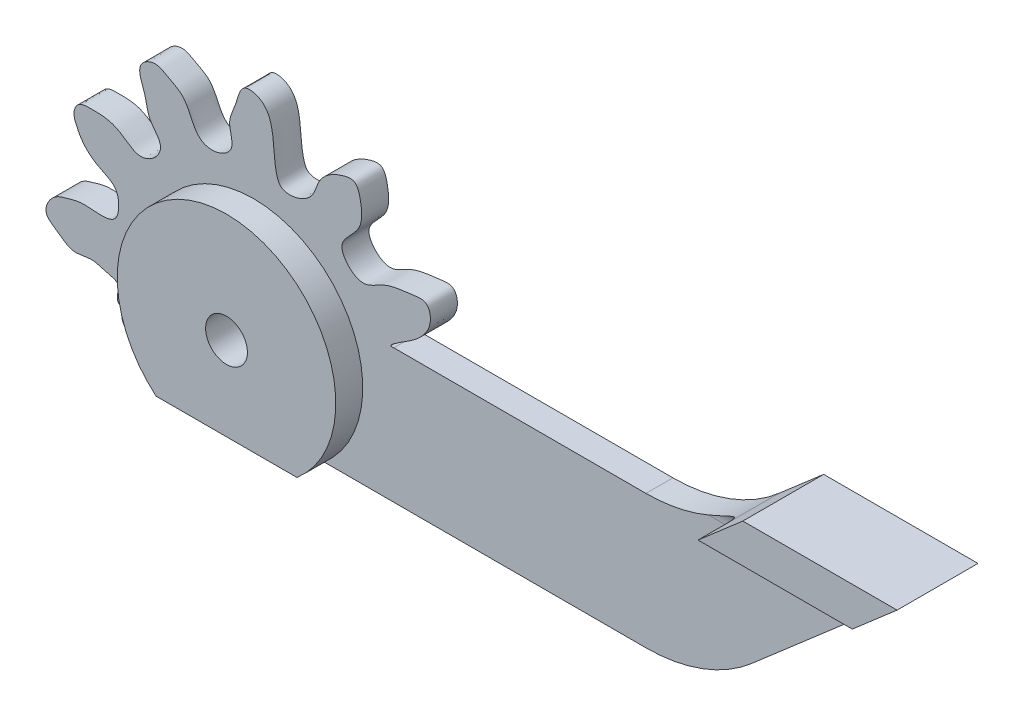
ISO-10303-21;
HEADER;
FILE_DESCRIPTION(('STEP AP214'),'2;1');
FILE_NAME('part.step','',(''),(''),'','','');
FILE_SCHEMA(('AUTOMOTIVE_DESIGN { 1 0 10303 214 1 1 1 1 }'));
ENDSEC;
DATA;
#1=APPLICATION_CONTEXT('core data for automotive mechanical design processes');
#2=APPLICATION_PROTOCOL_DEFINITION('international standard','automotive_design',2000,#1);
#3=PRODUCT_CONTEXT('',#1,'mechanical');
#4=PRODUCT('Part','Part','',(#3));
#5=PRODUCT_RELATED_PRODUCT_CATEGORY('part','',(#4));
#6=PRODUCT_DEFINITION_FORMATION('','',#4);
#7=PRODUCT_DEFINITION_CONTEXT('part definition',#1,'design');
#8=PRODUCT_DEFINITION('design','',#6,#7);
#9=PRODUCT_DEFINITION_SHAPE('','',#8);
#10=(LENGTH_UNIT() NAMED_UNIT(*) SI_UNIT(.MILLI.,.METRE.));
#11=(NAMED_UNIT(*) PLANE_ANGLE_UNIT() SI_UNIT($,.RADIAN.));
#12=(NAMED_UNIT(*) SI_UNIT($,.STERADIAN.) SOLID_ANGLE_UNIT());
#13=UNCERTAINTY_MEASURE_WITH_UNIT(LENGTH_MEASURE(1.E-05),#10,'distance_accuracy_value','');
#14=(GEOMETRIC_REPRESENTATION_CONTEXT(3) GLOBAL_UNCERTAINTY_ASSIGNED_CONTEXT((#13)) GLOBAL_UNIT_ASSIGNED_CONTEXT((#10,
#11,#12)) REPRESENTATION_CONTEXT('',''));
#15=CARTESIAN_POINT('',(0.,0.,0.));
#16=DIRECTION('',(0.,0.,1.));
#17=DIRECTION('',(1.,0.,0.));
#18=AXIS2_PLACEMENT_3D('',#15,#16,#17);
#19=CARTESIAN_POINT('',(39.415666495628,19.4070161025371,10.));
#20=DIRECTION('',(0.,0.,-1.));
#21=DIRECTION('',(-1.,0.,0.));
#22=AXIS2_PLACEMENT_3D('',#19,#20,#21);
#23=CYLINDRICAL_SURFACE('',#22,20.2702286247449);
#24=CARTESIAN_POINT('',(39.415666495628,19.4070161025371,0.));
#25=DIRECTION('',(0.,0.,1.));
#26=DIRECTION('',(1.,0.,0.));
#27=AXIS2_PLACEMENT_3D('',#24,#25,#26);
#28=CIRCLE('',#27,20.2702286247449);
#29=CARTESIAN_POINT('',(52.4767262859784,3.90569726663405,0.));
#30=VERTEX_POINT('',#29);
#31=CARTESIAN_POINT('',(26.3546067052777,3.90569726663405,0.));
#32=VERTEX_POINT('',#31);
#33=EDGE_CURVE('E75',#30,#32,#28,.T.);
#34=ORIENTED_EDGE('',*,*,#33,.T.);
#35=DIRECTION('',(0.,0.,-1.));
#36=VECTOR('',#35,1.);
#37=CARTESIAN_POINT('',(26.3546067052777,3.90569726663405,10.));
#38=LINE('',#37,#36);
#39=CARTESIAN_POINT('',(26.3546067052777,3.90569726663405,10.));
#40=VERTEX_POINT('',#39);
#41=EDGE_CURVE('E12',#40,#32,#38,.T.);
#42=ORIENTED_EDGE('',*,*,#41,.F.);
#43=CARTESIAN_POINT('',(39.415666495628,19.4070161025371,10.));
#44=DIRECTION('',(0.,0.,1.));
#45=DIRECTION('',(1.,0.,0.));
#46=AXIS2_PLACEMENT_3D('',#43,#44,#45);
#47=CIRCLE('',#46,20.2702286247449);
#48=CARTESIAN_POINT('',(52.4767262859784,3.90569726663405,10.));
#49=VERTEX_POINT('',#48);
#50=EDGE_CURVE('E77',#49,#40,#47,.T.);
#51=ORIENTED_EDGE('',*,*,#50,.F.);
#52=DIRECTION('',(0.,0.,-1.));
#53=VECTOR('',#52,1.);
#54=CARTESIAN_POINT('',(52.4767262859784,3.90569726663405,10.));
#55=LINE('',#54,#53);
#56=EDGE_CURVE('E59',#49,#30,#55,.T.);
#57=ORIENTED_EDGE('',*,*,#56,.T.);
#58=EDGE_LOOP('',(#34,#42,#51,#57));
#59=FACE_BOUND('',#58,.T.);
#60=ADVANCED_FACE('F51',(#59),#23,.T.);
#61=CARTESIAN_POINT('',(52.4767262859784,3.90569726663405,10.));
#62=DIRECTION('',(0.,-1.,0.));
#63=DIRECTION('',(0.,0.,-1.));
#64=AXIS2_PLACEMENT_3D('',#61,#62,#63);
#65=PLANE('',#64);
#66=DIRECTION('',(-1.,0.,0.));
#67=VECTOR('',#66,1.);
#68=CARTESIAN_POINT('',(52.4767262859784,3.90569726663405,0.));
#69=LINE('',#68,#67);
#70=EDGE_CURVE('E82',#30,#32,#69,.T.);
#71=ORIENTED_EDGE('',*,*,#70,.F.);
#72=ORIENTED_EDGE('',*,*,#56,.F.);
#73=DIRECTION('',(-1.,0.,0.));
#74=VECTOR('',#73,1.);
#75=CARTESIAN_POINT('',(52.4767262859784,3.90569726663405,10.));
#76=LINE('',#75,#74);
#77=EDGE_CURVE('E79',#49,#40,#76,.T.);
#78=ORIENTED_EDGE('',*,*,#77,.T.);
#79=ORIENTED_EDGE('',*,*,#41,.T.);
#80=EDGE_LOOP('',(#71,#72,#78,#79));
#81=FACE_BOUND('',#80,.T.);
#82=ADVANCED_FACE('F85',(#81),#65,.T.);
#83=CARTESIAN_POINT('',(39.415666495628,19.4070161025371,10.));
#84=DIRECTION('',(0.,0.,1.));
#85=DIRECTION('',(1.,0.,0.));
#86=AXIS2_PLACEMENT_3D('',#83,#84,#85);
#87=PLANE('',#86);
#88=CARTESIAN_POINT('',(39.415666495628,19.4070161025371,10.));
#89=DIRECTION('',(0.,0.,1.));
#90=DIRECTION('',(1.,0.,0.));
#91=AXIS2_PLACEMENT_3D('',#88,#89,#90);
#92=CIRCLE('',#91,3.87742038559669);
#93=CARTESIAN_POINT('',(43.2930868812247,19.4070161025371,10.));
#94=VERTEX_POINT('',#93);
#95=EDGE_CURVE('E90',#94,#94,#92,.T.);
#96=ORIENTED_EDGE('',*,*,#95,.F.);
#97=EDGE_LOOP('',(#96));
#98=FACE_BOUND('',#97,.T.);
#99=ORIENTED_EDGE('',*,*,#50,.T.);
#100=ORIENTED_EDGE('',*,*,#77,.F.);
#101=EDGE_LOOP('',(#99,#100));
#102=FACE_BOUND('',#101,.T.);
#103=ADVANCED_FACE('F103',(#98,#102),#87,.T.);
#104=CARTESIAN_POINT('',(39.415666495628,19.4070161025371,0.));
#105=DIRECTION('',(0.,0.,1.));
#106=DIRECTION('',(1.,0.,0.));
#107=AXIS2_PLACEMENT_3D('',#104,#105,#106);
#108=PLANE('',#107);
#109=CARTESIAN_POINT('',(39.415666495628,19.4070161025371,0.));
#110=DIRECTION('',(0.,0.,1.));
#111=DIRECTION('',(1.,0.,0.));
#112=AXIS2_PLACEMENT_3D('',#109,#110,#111);
#113=CIRCLE('',#112,3.87742038559669);
#114=CARTESIAN_POINT('',(43.2930868812247,19.4070161025371,0.));
#115=VERTEX_POINT('',#114);
#116=EDGE_CURVE('E83',#115,#115,#113,.T.);
#117=ORIENTED_EDGE('',*,*,#116,.T.);
#118=EDGE_LOOP('',(#117));
#119=FACE_BOUND('',#118,.T.);
#120=ORIENTED_EDGE('',*,*,#33,.F.);
#121=ORIENTED_EDGE('',*,*,#70,.T.);
#122=EDGE_LOOP('',(#120,#121));
#123=FACE_BOUND('',#122,.T.);
#124=ADVANCED_FACE('F81',(#119,#123),#108,.F.);
#125=CARTESIAN_POINT('',(39.415666495628,19.4070161025371,0.));
#126=DIRECTION('',(0.,0.,1.));
#127=DIRECTION('',(1.,0.,0.));
#128=AXIS2_PLACEMENT_3D('',#125,#126,#127);
#129=CYLINDRICAL_SURFACE('',#128,3.87742038559669);
#130=ORIENTED_EDGE('',*,*,#116,.F.);
#131=EDGE_LOOP('',(#130));
#132=FACE_BOUND('',#131,.T.);
#133=ORIENTED_EDGE('',*,*,#95,.T.);
#134=EDGE_LOOP('',(#133));
#135=FACE_BOUND('',#134,.T.);
#136=ADVANCED_FACE('F97',(#132,#135),#129,.F.);
#137=CLOSED_SHELL('',(#60,#82,#103,#124,#136));
#138=MANIFOLD_SOLID_BREP('B2',#137);
#139=CARTESIAN_POINT('',(15.2096444111176,9.97968430753762,5.));
#140=CARTESIAN_POINT('',(13.2812394112684,10.363568562619,5.));
#141=CARTESIAN_POINT('',(15.5409479278548,13.6056661087961,5.));
#142=CARTESIAN_POINT('',(11.8960696273522,14.1744904956881,5.));
#143=CARTESIAN_POINT('',(9.41472392617126,15.2837824863121,5.));
#144=CARTESIAN_POINT('',(5.84577228653019,13.9195039232922,5.));
#145=CARTESIAN_POINT('',(3.32447443002871,16.1594676521129,5.));
#146=CARTESIAN_POINT('',(0.108136148444864,17.949329474019,5.));
#147=CARTESIAN_POINT('',(2.00428086387749,21.6553190020502,5.));
#148=CARTESIAN_POINT('',(4.83312567613509,22.4395628591093,5.));
#149=CARTESIAN_POINT('',(7.75078146066194,23.2339828730488,5.));
#150=CARTESIAN_POINT('',(10.55114440638,22.735013364721,5.));
#151=CARTESIAN_POINT('',(14.0598197716537,23.0101572900811,5.));
#152=CARTESIAN_POINT('',(14.6059543172087,26.0947553540203,5.));
#153=CARTESIAN_POINT('',(13.9721102271966,29.086650125727,5.));
#154=CARTESIAN_POINT('',(10.5072725974297,30.3014618215186,5.));
#155=CARTESIAN_POINT('',(7.9513678270161,32.3460104271725,5.));
#156=CARTESIAN_POINT('',(6.62718359713608,34.8128911148974,5.));
#157=CARTESIAN_POINT('',(5.83683228221396,36.7719163365309,5.));
#158=CARTESIAN_POINT('',(6.90615802743257,39.0385229301238,5.));
#159=CARTESIAN_POINT('',(9.89872652748119,39.0453688187228,5.));
#160=CARTESIAN_POINT('',(12.7362153710987,38.9952326924493,5.));
#161=CARTESIAN_POINT('',(15.5408859462902,37.5004095880644,5.));
#162=CARTESIAN_POINT('',(18.1574843118457,35.2644587234455,5.));
#163=CARTESIAN_POINT('',(21.3930666976063,36.8883233474547,5.));
#164=CARTESIAN_POINT('',(22.7711430009313,40.0899680700124,5.));
#165=CARTESIAN_POINT('',(19.8262806533943,42.4313643406528,5.));
#166=CARTESIAN_POINT('',(19.6056833608479,46.3863892380823,5.));
#167=CARTESIAN_POINT('',(17.0681696084714,50.6713055678059,5.));
#168=CARTESIAN_POINT('',(21.211474567562,52.6785628083915,5.));
#169=CARTESIAN_POINT('',(23.719932093889,51.1311240842665,5.));
#170=CARTESIAN_POINT('',(26.4606619234267,49.9140476634965,5.));
#171=CARTESIAN_POINT('',(27.8481008740992,46.8411658178877,5.));
#172=CARTESIAN_POINT('',(29.3765187861785,43.7801231747238,5.));
#173=CARTESIAN_POINT('',(32.930275422778,43.3517409507978,5.));
#174=CARTESIAN_POINT('',(36.2842604956314,45.6861185984047,5.));
#175=CARTESIAN_POINT('',(34.3194898999652,49.7106001444772,5.));
#176=CARTESIAN_POINT('',(36.3256799593775,52.9415088850657,5.));
#177=CARTESIAN_POINT('',(37.0189571453503,57.4860230593159,5.));
#178=CARTESIAN_POINT('',(41.5584164467512,56.3191860063089,5.));
#179=CARTESIAN_POINT('',(43.405482683016,51.8019787660292,5.));
#180=CARTESIAN_POINT('',(43.0466348301985,47.7708596963115,5.));
#181=CARTESIAN_POINT('',(44.3829726718081,43.4741934454998,5.));
#182=CARTESIAN_POINT('',(47.9539881976018,43.5818910244991,5.));
#183=CARTESIAN_POINT('',(50.653934449939,45.4846918597356,5.));
#184=CARTESIAN_POINT('',(51.5597023071631,49.4586580840743,5.));
#185=CARTESIAN_POINT('',(54.5931918783009,51.4093636145941,5.));
#186=CARTESIAN_POINT('',(58.5849168323416,52.2743012092694,5.));
#187=CARTESIAN_POINT('',(59.5661344349158,48.3250216380914,5.));
#188=CARTESIAN_POINT('',(59.682159996152,44.047072630065,5.));
#189=CARTESIAN_POINT('',(54.9863467534639,41.209123758002,5.));
#190=CARTESIAN_POINT('',(56.7526925196278,37.5706693816871,5.));
#191=CARTESIAN_POINT('',(59.8265787402288,35.4456014072274,5.));
#192=CARTESIAN_POINT('',(63.8708438457671,38.4956234264064,5.));
#193=CARTESIAN_POINT('',(67.5710932302871,38.7288140631102,5.));
#194=CARTESIAN_POINT('',(71.7470448028108,39.4081574248454,5.));
#195=CARTESIAN_POINT('',(72.8305822029521,35.3228178835334,5.));
#196=CARTESIAN_POINT('',(69.6894235093443,32.0103288326518,5.));
#197=CARTESIAN_POINT('',(67.3772303033655,30.7156132713001,5.));
#198=CARTESIAN_POINT('',(64.1194138088529,28.5241532581021,5.));
#199=CARTESIAN_POINT('',(65.4493024148734,28.7160131888127,5.));
#200=B_SPLINE_CURVE_WITH_KNOTS('',3,(#139,#140,#141,#142,#143,#144,#145,#146,#147,#148,#149,
#150,#151,#152,#153,#154,#155,#156,#157,#158,#159,#160,#161,#162,#163,#164,#165,#166,#167,#168,
#169,#170,#171,#172,#173,#174,#175,#176,#177,#178,#179,#180,#181,#182,#183,#184,#185,#186,#187,
#188,#189,#190,#191,#192,#193,#194,#195,#196,#197,#198,#199),.UNSPECIFIED.,.F.,.F.,(4,1,1,1,1,1,
1,1,1,1,1,1,1,1,1,1,1,1,1,1,1,1,1,1,1,1,1,1,1,1,1,1,1,1,1,1,1,1,1,1,1,1,1,1,1,1,1,1,1,1,1,1,1,1,
1,1,1,1,4),(0.,0.0180826304582996,0.0294270811508162,0.0442216103312733,0.063460114385005,
0.0800363581027234,0.0950671107742006,0.112886037354315,0.127916790025792,0.141223750458327,
0.159055851847325,0.173850381027782,0.188160769885949,0.200964039878945,0.218835607420363,
0.240246417504569,0.251297246649715,0.262600218407398,0.271795064050294,0.285102024482828,
0.304401467884786,0.316661262075313,0.334440605652273,0.353445758219558,0.362991486223038,
0.384159610558991,0.399787843011524,0.42683069534502,0.442771374586194,0.453843434930827,
0.471715002472244,0.487699818427079,0.505386457159968,0.521282877141525,0.537873282539501,
0.557753673848156,0.57752579922451,0.59775445963888,0.614528438902255,0.632584081752777,
0.669920137159158,0.679857379116126,0.696387655654468,0.714648165372121,0.729010973412608,
0.756644506005,0.768187608437239,0.783639326994869,0.807616550927122,0.835445203560578,
0.846136559508647,0.865318338654449,0.884866848636363,0.91519590447389,0.928380171735728,
0.940606205006962,0.968676850479003,0.986468342205925,1.),.UNSPECIFIED.);
#201=DIRECTION('',(0.,0.,-1.));
#202=VECTOR('',#201,1.);
#203=SURFACE_OF_LINEAR_EXTRUSION('',#200,#202);
#204=CARTESIAN_POINT('',(15.2096444111176,9.97968430753762,0.));
#205=CARTESIAN_POINT('',(13.2812394112684,10.363568562619,0.));
#206=CARTESIAN_POINT('',(15.5409479278548,13.6056661087961,0.));
#207=CARTESIAN_POINT('',(11.8960696273522,14.1744904956881,0.));
#208=CARTESIAN_POINT('',(9.41472392617126,15.2837824863121,0.));
#209=CARTESIAN_POINT('',(5.84577228653019,13.9195039232922,0.));
#210=CARTESIAN_POINT('',(3.32447443002871,16.1594676521129,0.));
#211=CARTESIAN_POINT('',(0.108136148444864,17.949329474019,0.));
#212=CARTESIAN_POINT('',(2.00428086387749,21.6553190020502,0.));
#213=CARTESIAN_POINT('',(4.83312567613509,22.4395628591093,0.));
#214=CARTESIAN_POINT('',(7.75078146066194,23.2339828730488,0.));
#215=CARTESIAN_POINT('',(10.55114440638,22.735013364721,0.));
#216=CARTESIAN_POINT('',(14.0598197716537,23.0101572900811,0.));
#217=CARTESIAN_POINT('',(14.6059543172087,26.0947553540203,0.));
#218=CARTESIAN_POINT('',(13.9721102271966,29.086650125727,0.));
#219=CARTESIAN_POINT('',(10.5072725974297,30.3014618215186,0.));
#220=CARTESIAN_POINT('',(7.9513678270161,32.3460104271725,0.));
#221=CARTESIAN_POINT('',(6.62718359713608,34.8128911148974,0.));
#222=CARTESIAN_POINT('',(5.83683228221396,36.7719163365309,0.));
#223=CARTESIAN_POINT('',(6.90615802743257,39.0385229301238,0.));
#224=CARTESIAN_POINT('',(9.89872652748119,39.0453688187228,0.));
#225=CARTESIAN_POINT('',(12.7362153710987,38.9952326924493,0.));
#226=CARTESIAN_POINT('',(15.5408859462902,37.5004095880644,0.));
#227=CARTESIAN_POINT('',(18.1574843118457,35.2644587234455,0.));
#228=CARTESIAN_POINT('',(21.3930666976063,36.8883233474547,0.));
#229=CARTESIAN_POINT('',(22.7711430009313,40.0899680700124,0.));
#230=CARTESIAN_POINT('',(19.8262806533943,42.4313643406528,0.));
#231=CARTESIAN_POINT('',(19.6056833608479,46.3863892380823,0.));
#232=CARTESIAN_POINT('',(17.0681696084714,50.6713055678059,0.));
#233=CARTESIAN_POINT('',(21.211474567562,52.6785628083915,0.));
#234=CARTESIAN_POINT('',(23.719932093889,51.1311240842665,0.));
#235=CARTESIAN_POINT('',(26.4606619234267,49.9140476634965,0.));
#236=CARTESIAN_POINT('',(27.8481008740992,46.8411658178877,0.));
#237=CARTESIAN_POINT('',(29.3765187861785,43.7801231747238,0.));
#238=CARTESIAN_POINT('',(32.930275422778,43.3517409507978,0.));
#239=CARTESIAN_POINT('',(36.2842604956314,45.6861185984047,0.));
#240=CARTESIAN_POINT('',(34.3194898999652,49.7106001444772,0.));
#241=CARTESIAN_POINT('',(36.3256799593775,52.9415088850657,0.));
#242=CARTESIAN_POINT('',(37.0189571453503,57.4860230593159,0.));
#243=CARTESIAN_POINT('',(41.5584164467512,56.3191860063089,0.));
#244=CARTESIAN_POINT('',(43.405482683016,51.8019787660292,0.));
#245=CARTESIAN_POINT('',(43.0466348301985,47.7708596963115,0.));
#246=CARTESIAN_POINT('',(44.3829726718081,43.4741934454998,0.));
#247=CARTESIAN_POINT('',(47.9539881976018,43.5818910244991,0.));
#248=CARTESIAN_POINT('',(50.653934449939,45.4846918597356,0.));
#249=CARTESIAN_POINT('',(51.5597023071631,49.4586580840743,0.));
#250=CARTESIAN_POINT('',(54.5931918783009,51.4093636145941,0.));
#251=CARTESIAN_POINT('',(58.5849168323416,52.2743012092694,0.));
#252=CARTESIAN_POINT('',(59.5661344349158,48.3250216380914,0.));
#253=CARTESIAN_POINT('',(59.682159996152,44.047072630065,0.));
#254=CARTESIAN_POINT('',(54.9863467534639,41.209123758002,0.));
#255=CARTESIAN_POINT('',(56.7526925196278,37.5706693816871,0.));
#256=CARTESIAN_POINT('',(59.8265787402288,35.4456014072274,0.));
#257=CARTESIAN_POINT('',(63.8708438457671,38.4956234264064,0.));
#258=CARTESIAN_POINT('',(67.5710932302871,38.7288140631102,0.));
#259=CARTESIAN_POINT('',(71.7470448028108,39.4081574248454,0.));
#260=CARTESIAN_POINT('',(72.8305822029521,35.3228178835334,0.));
#261=CARTESIAN_POINT('',(69.6894235093443,32.0103288326518,0.));
#262=CARTESIAN_POINT('',(67.3772303033655,30.7156132713001,0.));
#263=CARTESIAN_POINT('',(64.1194138088529,28.5241532581021,0.));
#264=CARTESIAN_POINT('',(65.4493024148734,28.7160131888127,0.));
#265=B_SPLINE_CURVE_WITH_KNOTS('',3,(#204,#205,#206,#207,#208,#209,#210,#211,#212,#213,#214,
#215,#216,#217,#218,#219,#220,#221,#222,#223,#224,#225,#226,#227,#228,#229,#230,#231,#232,#233,
#234,#235,#236,#237,#238,#239,#240,#241,#242,#243,#244,#245,#246,#247,#248,#249,#250,#251,#252,
#253,#254,#255,#256,#257,#258,#259,#260,#261,#262,#263,#264),.UNSPECIFIED.,.F.,.F.,(4,1,1,1,1,1,
1,1,1,1,1,1,1,1,1,1,1,1,1,1,1,1,1,1,1,1,1,1,1,1,1,1,1,1,1,1,1,1,1,1,1,1,1,1,1,1,1,1,1,1,1,1,1,1,
1,1,1,1,4),(0.,0.0180826304582996,0.0294270811508162,0.0442216103312733,0.063460114385005,
0.0800363581027234,0.0950671107742006,0.112886037354315,0.127916790025792,0.141223750458327,
0.159055851847325,0.173850381027782,0.188160769885949,0.200964039878945,0.218835607420363,
0.240246417504569,0.251297246649715,0.262600218407398,0.271795064050294,0.285102024482828,
0.304401467884786,0.316661262075313,0.334440605652273,0.353445758219558,0.362991486223038,
0.384159610558991,0.399787843011524,0.42683069534502,0.442771374586194,0.453843434930827,
0.471715002472244,0.487699818427079,0.505386457159968,0.521282877141525,0.537873282539501,
0.557753673848156,0.57752579922451,0.59775445963888,0.614528438902255,0.632584081752777,
0.669920137159158,0.679857379116126,0.696387655654468,0.714648165372121,0.729010973412608,
0.756644506005,0.768187608437239,0.783639326994869,0.807616550927122,0.835445203560578,
0.846136559508647,0.865318338654449,0.884866848636363,0.91519590447389,0.928380171735728,
0.940606205006962,0.968676850479003,0.986468342205925,1.),.UNSPECIFIED.);
#266=CARTESIAN_POINT('',(15.2096444111176,9.97968430753762,0.));
#267=VERTEX_POINT('',#266);
#268=CARTESIAN_POINT('',(65.4493024148734,28.7160131888127,0.));
#269=VERTEX_POINT('',#268);
#270=EDGE_CURVE('E284',#267,#269,#265,.T.);
#271=ORIENTED_EDGE('',*,*,#270,.F.);
#272=DIRECTION('',(0.,0.,-1.));
#273=VECTOR('',#272,1.);
#274=CARTESIAN_POINT('',(15.2096444111176,9.97968430753762,5.));
#275=LINE('',#274,#273);
#276=CARTESIAN_POINT('',(15.2096444111176,9.97968430753762,5.));
#277=VERTEX_POINT('',#276);
#278=EDGE_CURVE('E449',#277,#267,#275,.T.);
#279=ORIENTED_EDGE('',*,*,#278,.F.);
#280=CARTESIAN_POINT('',(65.4493024148734,28.7160131888127,5.));
#281=VERTEX_POINT('',#280);
#282=EDGE_CURVE('E285',#277,#281,#200,.T.);
#283=ORIENTED_EDGE('',*,*,#282,.T.);
#284=DIRECTION('',(0.,0.,-1.));
#285=VECTOR('',#284,1.);
#286=CARTESIAN_POINT('',(65.4493024148734,28.7160131888127,5.));
#287=LINE('',#286,#285);
#288=EDGE_CURVE('E374',#281,#269,#287,.T.);
#289=ORIENTED_EDGE('',*,*,#288,.T.);
#290=EDGE_LOOP('',(#271,#279,#283,#289));
#291=FACE_BOUND('',#290,.T.);
#292=ADVANCED_FACE('F144',(#291),#203,.T.);
#293=CARTESIAN_POINT('',(15.2096444111176,9.97968430753762,5.));
#294=CARTESIAN_POINT('',(13.8781080278113,5.49026163766893,5.));
#295=CARTESIAN_POINT('',(19.4225429995178,6.03859698340414,5.));
#296=CARTESIAN_POINT('',(21.5208288763892,3.90569726663405,5.));
#297=B_SPLINE_CURVE_WITH_KNOTS('',3,(#293,#294,#295,#296),.UNSPECIFIED.,.F.,.F.,(4,4),(0.,1.),.UNSPECIFIED.);
#298=DIRECTION('',(0.,0.,-1.));
#299=VECTOR('',#298,1.);
#300=SURFACE_OF_LINEAR_EXTRUSION('',#297,#299);
#301=CARTESIAN_POINT('',(15.2096444111176,9.97968430753762,0.));
#302=CARTESIAN_POINT('',(13.8781080278113,5.49026163766893,0.));
#303=CARTESIAN_POINT('',(19.4225429995178,6.03859698340414,0.));
#304=CARTESIAN_POINT('',(21.5208288763892,3.90569726663405,0.));
#305=B_SPLINE_CURVE_WITH_KNOTS('',3,(#301,#302,#303,#304),.UNSPECIFIED.,.F.,.F.,(4,4),(0.,1.),.UNSPECIFIED.);
#306=CARTESIAN_POINT('',(21.5208288763892,3.90569726663405,0.));
#307=VERTEX_POINT('',#306);
#308=EDGE_CURVE('E385',#267,#307,#305,.T.);
#309=ORIENTED_EDGE('',*,*,#308,.T.);
#310=DIRECTION('',(0.,0.,-1.));
#311=VECTOR('',#310,1.);
#312=CARTESIAN_POINT('',(21.5208288763892,3.90569726663405,5.));
#313=LINE('',#312,#311);
#314=CARTESIAN_POINT('',(21.5208288763892,3.90569726663405,5.));
#315=VERTEX_POINT('',#314);
#316=EDGE_CURVE('E446',#315,#307,#313,.T.);
#317=ORIENTED_EDGE('',*,*,#316,.F.);
#318=EDGE_CURVE('E292',#277,#315,#297,.T.);
#319=ORIENTED_EDGE('',*,*,#318,.F.);
#320=ORIENTED_EDGE('',*,*,#278,.T.);
#321=EDGE_LOOP('',(#309,#317,#319,#320));
#322=FACE_BOUND('',#321,.T.);
#323=ADVANCED_FACE('F303',(#322),#300,.F.);
#324=CARTESIAN_POINT('',(0.,3.90569726663405,5.));
#325=DIRECTION('',(0.,-1.,0.));
#326=DIRECTION('',(0.,0.,-1.));
#327=AXIS2_PLACEMENT_3D('',#324,#325,#326);
#328=PLANE('',#327);
#329=DIRECTION('',(-1.,0.,0.));
#330=VECTOR('',#329,1.);
#331=CARTESIAN_POINT('',(0.,3.90569726663405,0.));
#332=LINE('',#331,#330);
#333=CARTESIAN_POINT('',(26.3546067052777,3.90569726663405,0.));
#334=VERTEX_POINT('',#333);
#335=EDGE_CURVE('E394',#334,#307,#332,.T.);
#336=ORIENTED_EDGE('',*,*,#335,.F.);
#337=DIRECTION('',(0.,0.,-1.));
#338=VECTOR('',#337,1.);
#339=CARTESIAN_POINT('',(26.3546067052777,3.90569726663405,5.));
#340=LINE('',#339,#338);
#341=CARTESIAN_POINT('',(26.3546067052777,3.90569726663405,5.));
#342=VERTEX_POINT('',#341);
#343=EDGE_CURVE('E443',#342,#334,#340,.T.);
#344=ORIENTED_EDGE('',*,*,#343,.F.);
#345=DIRECTION('',(-1.,0.,0.));
#346=VECTOR('',#345,1.);
#347=CARTESIAN_POINT('',(0.,3.90569726663405,5.));
#348=LINE('',#347,#346);
#349=EDGE_CURVE('E474',#342,#315,#348,.T.);
#350=ORIENTED_EDGE('',*,*,#349,.T.);
#351=ORIENTED_EDGE('',*,*,#316,.T.);
#352=EDGE_LOOP('',(#336,#344,#350,#351));
#353=FACE_BOUND('',#352,.T.);
#354=ADVANCED_FACE('F307',(#353),#328,.T.);
#355=CARTESIAN_POINT('',(39.415666495628,19.4070161025371,5.));
#356=DIRECTION('',(0.,0.,-1.));
#357=DIRECTION('',(-1.,0.,0.));
#358=AXIS2_PLACEMENT_3D('',#355,#356,#357);
#359=CYLINDRICAL_SURFACE('',#358,20.2702286247449);
#360=CARTESIAN_POINT('',(39.415666495628,19.4070161025371,0.));
#361=DIRECTION('',(0.,0.,1.));
#362=DIRECTION('',(1.,0.,0.));
#363=AXIS2_PLACEMENT_3D('',#360,#361,#362);
#364=CIRCLE('',#363,20.2702286247449);
#365=CARTESIAN_POINT('',(52.4767262859784,3.90569726663405,0.));
#366=VERTEX_POINT('',#365);
#367=EDGE_CURVE('E401',#366,#334,#364,.T.);
#368=ORIENTED_EDGE('',*,*,#367,.F.);
#369=DIRECTION('',(0.,0.,-1.));
#370=VECTOR('',#369,1.);
#371=CARTESIAN_POINT('',(52.4767262859784,3.90569726663405,5.));
#372=LINE('',#371,#370);
#373=CARTESIAN_POINT('',(52.4767262859784,3.90569726663405,5.));
#374=VERTEX_POINT('',#373);
#375=EDGE_CURVE('E440',#374,#366,#372,.T.);
#376=ORIENTED_EDGE('',*,*,#375,.F.);
#377=CARTESIAN_POINT('',(39.415666495628,19.4070161025371,5.));
#378=DIRECTION('',(0.,0.,1.));
#379=DIRECTION('',(1.,0.,0.));
#380=AXIS2_PLACEMENT_3D('',#377,#378,#379);
#381=CIRCLE('',#380,20.2702286247449);
#382=EDGE_CURVE('E476',#374,#342,#381,.T.);
#383=ORIENTED_EDGE('',*,*,#382,.T.);
#384=ORIENTED_EDGE('',*,*,#343,.T.);
#385=EDGE_LOOP('',(#368,#376,#383,#384));
#386=FACE_BOUND('',#385,.T.);
#387=ADVANCED_FACE('F309',(#386),#359,.F.);
#388=CARTESIAN_POINT('',(112.213678781945,3.90569726663405,0.));
#389=VERTEX_POINT('',#388);
#390=EDGE_CURVE('E402',#389,#366,#332,.T.);
#391=ORIENTED_EDGE('',*,*,#390,.F.);
#392=DIRECTION('',(0.,0.,-1.));
#393=VECTOR('',#392,1.);
#394=CARTESIAN_POINT('',(112.213678781945,3.90569726663405,5.));
#395=LINE('',#394,#393);
#396=CARTESIAN_POINT('',(112.213678781945,3.90569726663405,5.));
#397=VERTEX_POINT('',#396);
#398=EDGE_CURVE('E437',#397,#389,#395,.T.);
#399=ORIENTED_EDGE('',*,*,#398,.F.);
#400=EDGE_CURVE('E477',#397,#374,#348,.T.);
#401=ORIENTED_EDGE('',*,*,#400,.T.);
#402=ORIENTED_EDGE('',*,*,#375,.T.);
#403=EDGE_LOOP('',(#391,#399,#401,#402));
#404=FACE_BOUND('',#403,.T.);
#405=ADVANCED_FACE('F312',(#404),#328,.T.);
#406=CARTESIAN_POINT('',(112.213678781945,33.905697266634,5.));
#407=DIRECTION('',(0.,0.,-1.));
#408=DIRECTION('',(-1.,0.,0.));
#409=AXIS2_PLACEMENT_3D('',#406,#407,#408);
#410=CYLINDRICAL_SURFACE('',#409,30.);
#411=CARTESIAN_POINT('',(112.213678781945,33.905697266634,0.));
#412=DIRECTION('',(0.,0.,1.));
#413=DIRECTION('',(1.,0.,0.));
#414=AXIS2_PLACEMENT_3D('',#411,#412,#413);
#415=CIRCLE('',#414,30.);
#416=CARTESIAN_POINT('',(131.865845605768,11.2387093959746,0.));
#417=VERTEX_POINT('',#416);
#418=EDGE_CURVE('E406',#417,#389,#415,.F.);
#419=ORIENTED_EDGE('',*,*,#418,.F.);
#420=DIRECTION('',(0.,0.,-1.));
#421=VECTOR('',#420,1.);
#422=CARTESIAN_POINT('',(131.865845605768,11.2387093959746,5.));
#423=LINE('',#422,#421);
#424=CARTESIAN_POINT('',(131.865845605768,11.2387093959746,5.));
#425=VERTEX_POINT('',#424);
#426=EDGE_CURVE('E434',#425,#417,#423,.T.);
#427=ORIENTED_EDGE('',*,*,#426,.F.);
#428=CARTESIAN_POINT('',(112.213678781945,33.905697266634,5.));
#429=DIRECTION('',(0.,0.,1.));
#430=DIRECTION('',(1.,0.,0.));
#431=AXIS2_PLACEMENT_3D('',#428,#429,#430);
#432=CIRCLE('',#431,30.);
#433=EDGE_CURVE('E376',#425,#397,#432,.F.);
#434=ORIENTED_EDGE('',*,*,#433,.T.);
#435=ORIENTED_EDGE('',*,*,#398,.T.);
#436=EDGE_LOOP('',(#419,#427,#434,#435));
#437=FACE_BOUND('',#436,.T.);
#438=ADVANCED_FACE('F316',(#437),#410,.T.);
#439=CARTESIAN_POINT('',(51.0236174300048,-58.8511041948351,5.));
#440=DIRECTION('',(0.655072227460769,-0.755566262355319,0.));
#441=DIRECTION('',(0.755566262355319,0.655072227460769,0.));
#442=AXIS2_PLACEMENT_3D('',#439,#440,#441);
#443=PLANE('',#442);
#444=DIRECTION('',(-0.755566262355319,-0.655072227460769,0.));
#445=VECTOR('',#444,1.);
#446=CARTESIAN_POINT('',(51.0236174300048,-58.8511041948351,0.));
#447=LINE('',#446,#445);
#448=CARTESIAN_POINT('',(168.796480576693,43.2573879914563,0.));
#449=VERTEX_POINT('',#448);
#450=EDGE_CURVE('E410',#449,#417,#447,.T.);
#451=ORIENTED_EDGE('',*,*,#450,.F.);
#452=DIRECTION('',(0.,0.,-1.));
#453=VECTOR('',#452,1.);
#454=CARTESIAN_POINT('',(168.796480576693,43.2573879914563,5.));
#455=LINE('',#454,#453);
#456=CARTESIAN_POINT('',(168.796480576693,43.2573879914563,15.));
#457=VERTEX_POINT('',#456);
#458=EDGE_CURVE('E258',#457,#449,#455,.T.);
#459=ORIENTED_EDGE('',*,*,#458,.F.);
#460=DIRECTION('',(0.755566262355318,0.65507222746077,0.));
#461=VECTOR('',#460,1.);
#462=CARTESIAN_POINT('',(160.482289538736,36.0490253181532,15.));
#463=LINE('',#462,#461);
#464=CARTESIAN_POINT('',(160.482289538736,36.0490253181532,15.));
#465=VERTEX_POINT('',#464);
#466=EDGE_CURVE('E271',#465,#457,#463,.T.);
#467=ORIENTED_EDGE('',*,*,#466,.F.);
#468=DIRECTION('',(0.,0.,-1.));
#469=VECTOR('',#468,1.);
#470=CARTESIAN_POINT('',(160.482289538736,36.0490253181532,15.));
#471=LINE('',#470,#469);
#472=CARTESIAN_POINT('',(160.482289538736,36.0490253181532,10.));
#473=VERTEX_POINT('',#472);
#474=EDGE_CURVE('E279',#465,#473,#471,.T.);
#475=ORIENTED_EDGE('',*,*,#474,.T.);
#476=CARTESIAN_POINT('',(154.71524408419,31.0490253181532,10.));
#477=DIRECTION('',(0.655072227460769,-0.755566262355319,0.));
#478=DIRECTION('',(0.755566262355319,0.655072227460769,0.));
#479=AXIS2_PLACEMENT_3D('',#476,#477,#478);
#480=ELLIPSE('',#479,7.63274611622798,5.);
#481=CARTESIAN_POINT('',(154.71524408419,31.0490253181532,5.));
#482=VERTEX_POINT('',#481);
#483=EDGE_CURVE('E159',#473,#482,#480,.F.);
#484=ORIENTED_EDGE('',*,*,#483,.T.);
#485=DIRECTION('',(-0.755566262355319,-0.655072227460769,0.));
#486=VECTOR('',#485,1.);
#487=CARTESIAN_POINT('',(51.0236174300048,-58.8511041948351,5.));
#488=LINE('',#487,#486);
#489=EDGE_CURVE('E370',#482,#425,#488,.T.);
#490=ORIENTED_EDGE('',*,*,#489,.T.);
#491=ORIENTED_EDGE('',*,*,#426,.T.);
#492=EDGE_LOOP('',(#451,#459,#467,#475,#484,#490,#491));
#493=FACE_BOUND('',#492,.T.);
#494=ADVANCED_FACE('F320',(#493),#443,.T.);
#495=CARTESIAN_POINT('',(0.,43.2573879914563,5.));
#496=DIRECTION('',(0.,1.,0.));
#497=DIRECTION('',(0.,0.,1.));
#498=AXIS2_PLACEMENT_3D('',#495,#496,#497);
#499=PLANE('',#498);
#500=DIRECTION('',(1.,0.,0.));
#501=VECTOR('',#500,1.);
#502=CARTESIAN_POINT('',(0.,43.2573879914563,0.));
#503=LINE('',#502,#501);
#504=CARTESIAN_POINT('',(140.180036643726,43.2573879914563,0.));
#505=VERTEX_POINT('',#504);
#506=EDGE_CURVE('E255',#505,#449,#503,.T.);
#507=ORIENTED_EDGE('',*,*,#506,.F.);
#508=DIRECTION('',(0.,0.,-1.));
#509=VECTOR('',#508,1.);
#510=CARTESIAN_POINT('',(140.180036643726,43.2573879914563,5.));
#511=LINE('',#510,#509);
#512=CARTESIAN_POINT('',(140.180036643726,43.2573879914563,15.));
#513=VERTEX_POINT('',#512);
#514=EDGE_CURVE('E249',#513,#505,#511,.T.);
#515=ORIENTED_EDGE('',*,*,#514,.F.);
#516=DIRECTION('',(-1.,0.,0.));
#517=VECTOR('',#516,1.);
#518=CARTESIAN_POINT('',(168.796480576693,43.2573879914563,15.));
#519=LINE('',#518,#517);
#520=EDGE_CURVE('E253',#457,#513,#519,.T.);
#521=ORIENTED_EDGE('',*,*,#520,.F.);
#522=ORIENTED_EDGE('',*,*,#458,.T.);
#523=EDGE_LOOP('',(#507,#515,#521,#522));
#524=FACE_BOUND('',#523,.T.);
#525=ADVANCED_FACE('F251',(#524),#499,.T.);
#526=CARTESIAN_POINT('',(38.7437397924403,-44.6873816924169,5.));
#527=DIRECTION('',(-0.655072227460769,0.755566262355319,0.));
#528=DIRECTION('',(-0.755566262355319,-0.655072227460769,0.));
#529=AXIS2_PLACEMENT_3D('',#526,#527,#528);
#530=PLANE('',#529);
#531=DIRECTION('',(0.755566262355319,0.655072227460769,0.));
#532=VECTOR('',#531,1.);
#533=CARTESIAN_POINT('',(38.7437397924403,-44.6873816924169,0.));
#534=LINE('',#533,#532);
#535=CARTESIAN_POINT('',(131.865845605768,36.0490253181532,0.));
#536=VERTEX_POINT('',#535);
#537=EDGE_CURVE('E416',#536,#505,#534,.T.);
#538=ORIENTED_EDGE('',*,*,#537,.F.);
#539=DIRECTION('',(0.,0.,-1.));
#540=VECTOR('',#539,1.);
#541=CARTESIAN_POINT('',(131.865845605768,36.0490253181532,5.));
#542=LINE('',#541,#540);
#543=CARTESIAN_POINT('',(131.865845605768,36.0490253181532,10.));
#544=VERTEX_POINT('',#543);
#545=EDGE_CURVE('E166',#544,#536,#542,.T.);
#546=ORIENTED_EDGE('',*,*,#545,.F.);
#547=DIRECTION('',(0.,0.,-1.));
#548=VECTOR('',#547,1.);
#549=CARTESIAN_POINT('',(131.865845605768,36.0490253181532,15.));
#550=LINE('',#549,#548);
#551=CARTESIAN_POINT('',(131.865845605768,36.0490253181532,15.));
#552=VERTEX_POINT('',#551);
#553=EDGE_CURVE('E262',#552,#544,#550,.T.);
#554=ORIENTED_EDGE('',*,*,#553,.F.);
#555=DIRECTION('',(-0.755566262355319,-0.655072227460769,0.));
#556=VECTOR('',#555,1.);
#557=CARTESIAN_POINT('',(140.180036643726,43.2573879914563,15.));
#558=LINE('',#557,#556);
#559=EDGE_CURVE('E260',#513,#552,#558,.T.);
#560=ORIENTED_EDGE('',*,*,#559,.F.);
#561=ORIENTED_EDGE('',*,*,#514,.T.);
#562=EDGE_LOOP('',(#538,#546,#554,#560,#561));
#563=FACE_BOUND('',#562,.T.);
#564=ADVANCED_FACE('F261',(#563),#530,.T.);
#565=CARTESIAN_POINT('',(112.213678781945,58.7160131888127,5.));
#566=DIRECTION('',(0.,0.,-1.));
#567=DIRECTION('',(-1.,0.,0.));
#568=AXIS2_PLACEMENT_3D('',#565,#566,#567);
#569=CYLINDRICAL_SURFACE('',#568,30.);
#570=CARTESIAN_POINT('',(112.213678781945,58.7160131888127,0.));
#571=DIRECTION('',(0.,0.,1.));
#572=DIRECTION('',(1.,0.,0.));
#573=AXIS2_PLACEMENT_3D('',#570,#571,#572);
#574=CIRCLE('',#573,30.);
#575=CARTESIAN_POINT('',(112.213678781945,28.7160131888127,0.));
#576=VERTEX_POINT('',#575);
#577=EDGE_CURVE('E419',#576,#536,#574,.T.);
#578=ORIENTED_EDGE('',*,*,#577,.F.);
#579=DIRECTION('',(0.,0.,-1.));
#580=VECTOR('',#579,1.);
#581=CARTESIAN_POINT('',(112.213678781945,28.7160131888127,5.));
#582=LINE('',#581,#580);
#583=CARTESIAN_POINT('',(112.213678781945,28.7160131888127,5.));
#584=VERTEX_POINT('',#583);
#585=EDGE_CURVE('E365',#584,#576,#582,.T.);
#586=ORIENTED_EDGE('',*,*,#585,.F.);
#587=CARTESIAN_POINT('',(112.213678781945,58.7160131888127,5.));
#588=DIRECTION('',(0.,0.,1.));
#589=DIRECTION('',(1.,0.,0.));
#590=AXIS2_PLACEMENT_3D('',#587,#588,#589);
#591=CIRCLE('',#590,30.);
#592=CARTESIAN_POINT('',(123.812721077099,31.0490253181532,5.));
#593=VERTEX_POINT('',#592);
#594=EDGE_CURVE('E364',#584,#593,#591,.T.);
#595=ORIENTED_EDGE('',*,*,#594,.T.);
#596=CARTESIAN_POINT('',(123.812721077099,31.0490253181532,5.));
#597=CARTESIAN_POINT('',(124.005901964938,31.1300116746344,5.00000946184176));
#598=CARTESIAN_POINT('',(124.198246724716,31.2130310009336,5.00196846730983));
#599=CARTESIAN_POINT('',(124.581118820881,31.3830609245057,5.01044148856215));
#600=CARTESIAN_POINT('',(124.771645681486,31.4700725338063,5.01695666534536));
#601=CARTESIAN_POINT('',(125.15151526925,31.6483826976189,5.03524083492646));
#602=CARTESIAN_POINT('',(125.340848433054,31.73969923131,5.04703400708409));
#603=CARTESIAN_POINT('',(125.71716930566,31.9260929592901,5.07662120252737));
#604=CARTESIAN_POINT('',(125.904157197791,32.0211698571895,5.09441475369546));
#605=CARTESIAN_POINT('',(126.277563745131,32.215975951215,5.13705039850044));
#606=CARTESIAN_POINT('',(126.463952989942,32.3157451019871,5.16196861341133));
#607=CARTESIAN_POINT('',(126.833640648959,32.5186628031803,5.21969738858776));
#608=CARTESIAN_POINT('',(127.016939294676,32.6218110987559,5.25250735485852));
#609=CARTESIAN_POINT('',(127.379634852012,32.8309303888314,5.32698048555324));
#610=CARTESIAN_POINT('',(127.559038494402,32.9368956687019,5.36862676873624));
#611=CARTESIAN_POINT('',(127.913664100461,33.151323371315,5.46193725572213));
#612=CARTESIAN_POINT('',(128.088887220337,33.2597850869242,5.51359865271277));
#613=CARTESIAN_POINT('',(128.390810185892,33.4509423697954,5.61373613716859));
#614=CARTESIAN_POINT('',(128.518593856276,33.5332311486475,5.65972465100236));
#615=CARTESIAN_POINT('',(128.771046578336,33.6984927943765,5.75858563307472));
#616=CARTESIAN_POINT('',(128.895715441204,33.7814657023195,5.81145851741973));
#617=CARTESIAN_POINT('',(129.141313138646,33.9475425150299,5.9246249330509));
#618=CARTESIAN_POINT('',(129.2622463471,34.0306461368139,5.98490933991736));
#619=CARTESIAN_POINT('',(129.499967060205,34.1965260675469,6.11358012070199));
#620=CARTESIAN_POINT('',(129.616754652555,34.279302383387,6.18196632309518));
#621=CARTESIAN_POINT('',(129.846595631292,34.4446218419753,6.32818720868566));
#622=CARTESIAN_POINT('',(129.959603972436,34.5271555919439,6.40610414697246));
#623=CARTESIAN_POINT('',(130.17986809492,34.6902995676349,6.57149745637208));
#624=CARTESIAN_POINT('',(130.287122286275,34.7709092583208,6.65897644959461));
#625=CARTESIAN_POINT('',(130.598490928943,35.0080800703397,6.93650266256787));
#626=CARTESIAN_POINT('',(130.792775470473,35.1603916514968,7.14198566413069));
#627=CARTESIAN_POINT('',(131.092320522223,35.4003009249874,7.5297929588432));
#628=CARTESIAN_POINT('',(131.206964921032,35.493763241093,7.70118029820184));
#629=CARTESIAN_POINT('',(131.361498924671,35.6213068471327,7.97407919848109));
#630=CARTESIAN_POINT('',(131.410127090119,35.6617320941021,8.06773850739533));
#631=CARTESIAN_POINT('',(131.500933079139,35.7376468060437,8.26002885584533));
#632=CARTESIAN_POINT('',(131.543113694413,35.7731384066118,8.35865771889423));
#633=CARTESIAN_POINT('',(131.620860618274,35.8388648010727,8.56161697779385));
#634=CARTESIAN_POINT('',(131.656345492293,35.8690346147516,8.66599980320937));
#635=CARTESIAN_POINT('',(131.719467601404,35.9229017996766,8.8786838157325));
#636=CARTESIAN_POINT('',(131.747109349006,35.9466028923726,8.98698270914134));
#637=CARTESIAN_POINT('',(131.793985330953,35.9869007750838,9.20640063670614));
#638=CARTESIAN_POINT('',(131.813239722392,36.0035145957236,9.31751222287618));
#639=CARTESIAN_POINT('',(131.84302564654,36.0292519594123,9.54168996622906));
#640=CARTESIAN_POINT('',(131.853565036743,36.0383822495887,9.6547542687129));
#641=CARTESIAN_POINT('',(131.861710092215,36.0454404373149,9.80677875196337));
#642=CARTESIAN_POINT('',(131.863261318954,36.046784986603,9.84541696993739));
#643=CARTESIAN_POINT('',(131.865328374191,36.0485768339029,9.92270139608015));
#644=CARTESIAN_POINT('',(131.865845284313,36.0490250692237,9.96134755359107));
#645=CARTESIAN_POINT('',(131.865845605768,36.0490253181532,10.));
#646=B_SPLINE_CURVE_WITH_KNOTS('',3,(#596,#597,#598,#599,#600,#601,#602,#603,#604,#605,#606,
#607,#608,#609,#610,#611,#612,#613,#614,#615,#616,#617,#618,#619,#620,#621,#622,#623,#624,#625,
#626,#627,#628,#629,#630,#631,#632,#633,#634,#635,#636,#637,#638,#639,#640,#641,#642,#643,#644,
#645),.UNSPECIFIED.,.F.,.F.,(4,2,2,2,2,2,2,2,2,2,2,2,2,2,2,2,2,2,2,2,2,2,2,2,4),(0.,
0.628411511524713,1.25698321261106,1.88846445715712,2.51989602753431,3.15834358683389,
3.79674310661778,4.43393381155595,5.07094619641667,5.5471650472079,6.02341269508316,
6.49907979177446,6.97473681980722,7.45483485400408,7.93506487268904,8.89321246864669,
9.56981692920625,9.90849739611762,10.2470308010074,10.5894480391161,10.9316678676334,
11.273060649529,11.6141452931394,11.7302054709929,11.8461442167593),.UNSPECIFIED.);
#647=EDGE_CURVE('E49',#593,#544,#646,.T.);
#648=ORIENTED_EDGE('',*,*,#647,.T.);
#649=ORIENTED_EDGE('',*,*,#545,.T.);
#650=EDGE_LOOP('',(#578,#586,#595,#648,#649));
#651=FACE_BOUND('',#650,.T.);
#652=ADVANCED_FACE('F327',(#651),#569,.F.);
#653=CARTESIAN_POINT('',(0.,28.7160131888127,5.));
#654=DIRECTION('',(0.,1.,0.));
#655=DIRECTION('',(0.,0.,1.));
#656=AXIS2_PLACEMENT_3D('',#653,#654,#655);
#657=PLANE('',#656);
#658=DIRECTION('',(1.,0.,0.));
#659=VECTOR('',#658,1.);
#660=CARTESIAN_POINT('',(0.,28.7160131888127,0.));
#661=LINE('',#660,#659);
#662=EDGE_CURVE('E293',#269,#576,#661,.T.);
#663=ORIENTED_EDGE('',*,*,#662,.F.);
#664=ORIENTED_EDGE('',*,*,#288,.F.);
#665=DIRECTION('',(1.,0.,0.));
#666=VECTOR('',#665,1.);
#667=CARTESIAN_POINT('',(0.,28.7160131888127,5.));
#668=LINE('',#667,#666);
#669=EDGE_CURVE('E369',#281,#584,#668,.T.);
#670=ORIENTED_EDGE('',*,*,#669,.T.);
#671=ORIENTED_EDGE('',*,*,#585,.T.);
#672=EDGE_LOOP('',(#663,#664,#670,#671));
#673=FACE_BOUND('',#672,.T.);
#674=ADVANCED_FACE('F331',(#673),#657,.T.);
#675=CARTESIAN_POINT('',(0.,0.,5.));
#676=DIRECTION('',(0.,0.,1.));
#677=DIRECTION('',(1.,0.,0.));
#678=AXIS2_PLACEMENT_3D('',#675,#676,#677);
#679=PLANE('',#678);
#680=ORIENTED_EDGE('',*,*,#489,.F.);
#681=DIRECTION('',(1.,0.,0.));
#682=VECTOR('',#681,1.);
#683=CARTESIAN_POINT('',(0.,31.0490253181532,5.));
#684=LINE('',#683,#682);
#685=EDGE_CURVE('E358',#482,#593,#684,.F.);
#686=ORIENTED_EDGE('',*,*,#685,.T.);
#687=ORIENTED_EDGE('',*,*,#594,.F.);
#688=ORIENTED_EDGE('',*,*,#669,.F.);
#689=ORIENTED_EDGE('',*,*,#282,.F.);
#690=ORIENTED_EDGE('',*,*,#318,.T.);
#691=ORIENTED_EDGE('',*,*,#349,.F.);
#692=ORIENTED_EDGE('',*,*,#382,.F.);
#693=ORIENTED_EDGE('',*,*,#400,.F.);
#694=ORIENTED_EDGE('',*,*,#433,.F.);
#695=EDGE_LOOP('',(#680,#686,#687,#688,#689,#690,#691,#692,#693,#694));
#696=FACE_BOUND('',#695,.T.);
#697=ADVANCED_FACE('F335',(#696),#679,.T.);
#698=CARTESIAN_POINT('',(0.,0.,0.));
#699=DIRECTION('',(0.,0.,1.));
#700=DIRECTION('',(1.,0.,0.));
#701=AXIS2_PLACEMENT_3D('',#698,#699,#700);
#702=PLANE('',#701);
#703=ORIENTED_EDGE('',*,*,#270,.T.);
#704=ORIENTED_EDGE('',*,*,#662,.T.);
#705=ORIENTED_EDGE('',*,*,#577,.T.);
#706=ORIENTED_EDGE('',*,*,#537,.T.);
#707=ORIENTED_EDGE('',*,*,#506,.T.);
#708=ORIENTED_EDGE('',*,*,#450,.T.);
#709=ORIENTED_EDGE('',*,*,#418,.T.);
#710=ORIENTED_EDGE('',*,*,#390,.T.);
#711=ORIENTED_EDGE('',*,*,#367,.T.);
#712=ORIENTED_EDGE('',*,*,#335,.T.);
#713=ORIENTED_EDGE('',*,*,#308,.F.);
#714=EDGE_LOOP('',(#703,#704,#705,#706,#707,#708,#709,#710,#711,#712,#713));
#715=FACE_BOUND('',#714,.T.);
#716=ADVANCED_FACE('F337',(#715),#702,.F.);
#717=CARTESIAN_POINT('',(131.865845605768,36.0490253181532,15.));
#718=DIRECTION('',(0.,1.,0.));
#719=DIRECTION('',(0.,0.,1.));
#720=AXIS2_PLACEMENT_3D('',#717,#718,#719);
#721=PLANE('',#720);
#722=ORIENTED_EDGE('',*,*,#553,.T.);
#723=DIRECTION('',(1.,0.,0.));
#724=VECTOR('',#723,1.);
#725=CARTESIAN_POINT('',(131.865845605768,36.0490253181532,10.));
#726=LINE('',#725,#724);
#727=EDGE_CURVE('E360',#544,#473,#726,.T.);
#728=ORIENTED_EDGE('',*,*,#727,.T.);
#729=ORIENTED_EDGE('',*,*,#474,.F.);
#730=DIRECTION('',(1.,0.,0.));
#731=VECTOR('',#730,1.);
#732=CARTESIAN_POINT('',(131.865845605768,36.0490253181532,15.));
#733=LINE('',#732,#731);
#734=EDGE_CURVE('E266',#552,#465,#733,.T.);
#735=ORIENTED_EDGE('',*,*,#734,.F.);
#736=EDGE_LOOP('',(#722,#728,#729,#735));
#737=FACE_BOUND('',#736,.T.);
#738=ADVANCED_FACE('F340',(#737),#721,.F.);
#739=CARTESIAN_POINT('',(0.,0.,15.));
#740=DIRECTION('',(0.,0.,1.));
#741=DIRECTION('',(1.,0.,0.));
#742=AXIS2_PLACEMENT_3D('',#739,#740,#741);
#743=PLANE('',#742);
#744=ORIENTED_EDGE('',*,*,#520,.T.);
#745=ORIENTED_EDGE('',*,*,#559,.T.);
#746=ORIENTED_EDGE('',*,*,#734,.T.);
#747=ORIENTED_EDGE('',*,*,#466,.T.);
#748=EDGE_LOOP('',(#744,#745,#746,#747));
#749=FACE_BOUND('',#748,.T.);
#750=ADVANCED_FACE('F269',(#749),#743,.T.);
#751=CARTESIAN_POINT('',(131.865845605768,31.0490253181532,10.));
#752=DIRECTION('',(1.,0.,0.));
#753=DIRECTION('',(0.,0.,-1.));
#754=AXIS2_PLACEMENT_3D('',#751,#752,#753);
#755=CYLINDRICAL_SURFACE('',#754,5.);
#756=ORIENTED_EDGE('',*,*,#647,.F.);
#757=ORIENTED_EDGE('',*,*,#685,.F.);
#758=ORIENTED_EDGE('',*,*,#483,.F.);
#759=ORIENTED_EDGE('',*,*,#727,.F.);
#760=EDGE_LOOP('',(#756,#757,#758,#759));
#761=FACE_BOUND('',#760,.T.);
#762=ADVANCED_FACE('F146',(#761),#755,.F.);
#763=CLOSED_SHELL('',(#292,#323,#354,#387,#405,#438,#494,#525,#564,#652,#674,#697,#716,#738,
#750,#762));
#764=MANIFOLD_SOLID_BREP('B6',#763);
#765=ADVANCED_BREP_SHAPE_REPRESENTATION('',(#18,#138,#764),#14);
#766=SHAPE_DEFINITION_REPRESENTATION(#9,#765);
ENDSEC;
END-ISO-10303-21;
